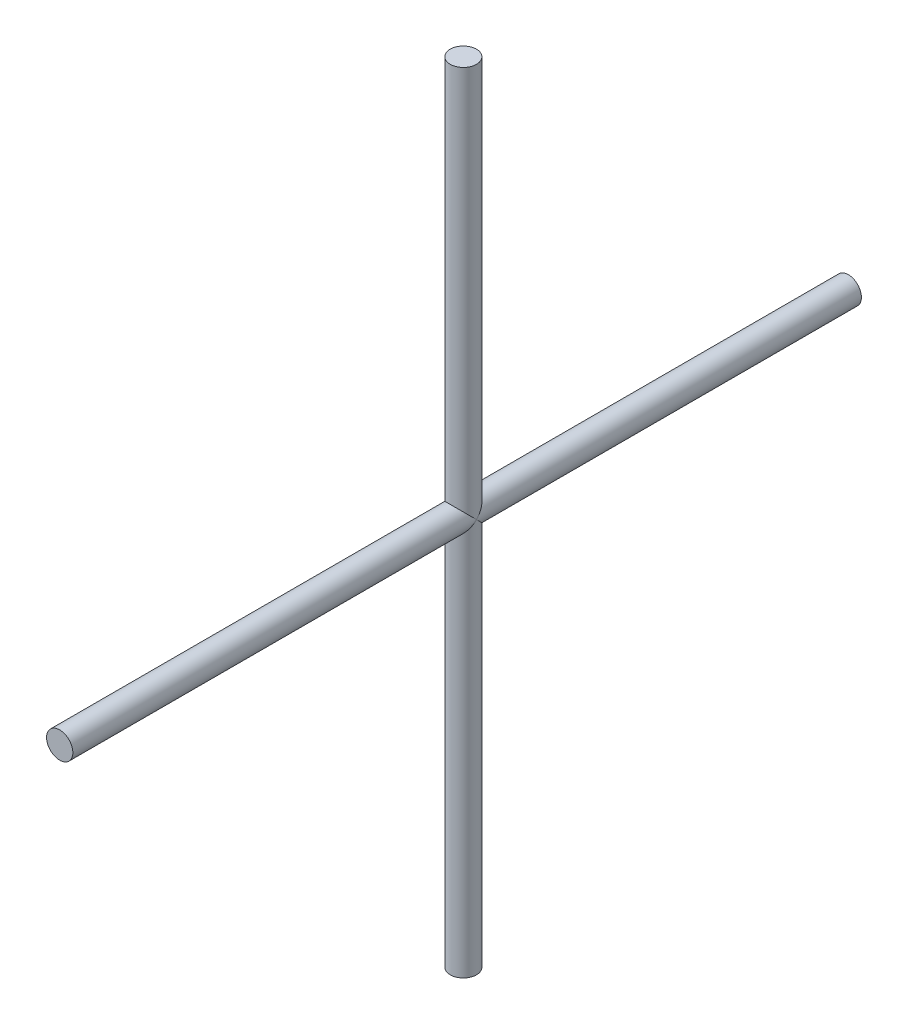
ISO-10303-21;
HEADER;
FILE_DESCRIPTION(('STEP AP214'),'2;1');
FILE_NAME('part.step','',(''),(''),'','','');
FILE_SCHEMA(('AUTOMOTIVE_DESIGN { 1 0 10303 214 1 1 1 1 }'));
ENDSEC;
DATA;
#1=APPLICATION_CONTEXT('core data for automotive mechanical design processes');
#2=APPLICATION_PROTOCOL_DEFINITION('international standard','automotive_design',2000,#1);
#3=PRODUCT_CONTEXT('',#1,'mechanical');
#4=PRODUCT('Part','Part','',(#3));
#5=PRODUCT_RELATED_PRODUCT_CATEGORY('part','',(#4));
#6=PRODUCT_DEFINITION_FORMATION('','',#4);
#7=PRODUCT_DEFINITION_CONTEXT('part definition',#1,'design');
#8=PRODUCT_DEFINITION('design','',#6,#7);
#9=PRODUCT_DEFINITION_SHAPE('','',#8);
#10=(LENGTH_UNIT() NAMED_UNIT(*) SI_UNIT(.MILLI.,.METRE.));
#11=(NAMED_UNIT(*) PLANE_ANGLE_UNIT() SI_UNIT($,.RADIAN.));
#12=(NAMED_UNIT(*) SI_UNIT($,.STERADIAN.) SOLID_ANGLE_UNIT());
#13=UNCERTAINTY_MEASURE_WITH_UNIT(LENGTH_MEASURE(1.E-05),#10,'distance_accuracy_value','');
#14=(GEOMETRIC_REPRESENTATION_CONTEXT(3) GLOBAL_UNCERTAINTY_ASSIGNED_CONTEXT((#13)) GLOBAL_UNIT_ASSIGNED_CONTEXT((#10,
#11,#12)) REPRESENTATION_CONTEXT('',''));
#15=CARTESIAN_POINT('',(0.,0.,0.));
#16=DIRECTION('',(0.,0.,1.));
#17=DIRECTION('',(1.,0.,0.));
#18=AXIS2_PLACEMENT_3D('',#15,#16,#17);
#19=CARTESIAN_POINT('',(0.,0.,300.));
#20=DIRECTION('',(0.,0.,-1.));
#21=DIRECTION('',(-1.,0.,0.));
#22=AXIS2_PLACEMENT_3D('',#19,#20,#21);
#23=CYLINDRICAL_SURFACE('',#22,5.);
#24=CARTESIAN_POINT('',(0.,0.,300.));
#25=DIRECTION('',(0.,0.,1.));
#26=DIRECTION('',(1.,0.,0.));
#27=AXIS2_PLACEMENT_3D('',#24,#25,#26);
#28=CIRCLE('',#27,5.);
#29=CARTESIAN_POINT('',(5.,0.,300.));
#30=VERTEX_POINT('',#29);
#31=EDGE_CURVE('E66',#30,#30,#28,.T.);
#32=ORIENTED_EDGE('',*,*,#31,.F.);
#33=EDGE_LOOP('',(#32));
#34=FACE_BOUND('',#33,.T.);
#35=CARTESIAN_POINT('',(0.,0.,146.435568708979));
#36=DIRECTION('',(0.,-0.707106781186547,-0.707106781186547));
#37=DIRECTION('',(0.,0.707106781186547,-0.707106781186547));
#38=AXIS2_PLACEMENT_3D('',#35,#36,#37);
#39=ELLIPSE('',#38,7.07106781186548,5.);
#40=CARTESIAN_POINT('',(5.,0.,146.435568708979));
#41=VERTEX_POINT('',#40);
#42=CARTESIAN_POINT('',(-5.,0.,146.435568708979));
#43=VERTEX_POINT('',#42);
#44=EDGE_CURVE('E48',#41,#43,#39,.T.);
#45=ORIENTED_EDGE('',*,*,#44,.F.);
#46=CARTESIAN_POINT('',(0.,0.,146.435568708979));
#47=DIRECTION('',(0.,0.707106781186547,-0.707106781186547));
#48=DIRECTION('',(0.,-0.707106781186547,-0.707106781186547));
#49=AXIS2_PLACEMENT_3D('',#46,#47,#48);
#50=ELLIPSE('',#49,7.07106781186548,5.);
#51=EDGE_CURVE('E60',#43,#41,#50,.T.);
#52=ORIENTED_EDGE('',*,*,#51,.F.);
#53=EDGE_LOOP('',(#45,#52));
#54=FACE_BOUND('',#53,.T.);
#55=ADVANCED_FACE('F39',(#34,#54),#23,.T.);
#56=CARTESIAN_POINT('',(0.,0.,300.));
#57=DIRECTION('',(0.,0.,1.));
#58=DIRECTION('',(1.,0.,0.));
#59=AXIS2_PLACEMENT_3D('',#56,#57,#58);
#60=PLANE('',#59);
#61=ORIENTED_EDGE('',*,*,#31,.T.);
#62=EDGE_LOOP('',(#61));
#63=FACE_BOUND('',#62,.T.);
#64=ADVANCED_FACE('F90',(#63),#60,.T.);
#65=CARTESIAN_POINT('',(0.,-150.,146.435568708979));
#66=DIRECTION('',(0.,1.,0.));
#67=DIRECTION('',(0.,0.,1.));
#68=AXIS2_PLACEMENT_3D('',#65,#66,#67);
#69=PLANE('',#68);
#70=CARTESIAN_POINT('',(0.,-150.,146.435568708979));
#71=DIRECTION('',(0.,1.,0.));
#72=DIRECTION('',(0.,0.,1.));
#73=AXIS2_PLACEMENT_3D('',#70,#71,#72);
#74=CIRCLE('',#73,5.);
#75=CARTESIAN_POINT('',(0.,-150.,151.435568708979));
#76=VERTEX_POINT('',#75);
#77=EDGE_CURVE('E106',#76,#76,#74,.T.);
#78=ORIENTED_EDGE('',*,*,#77,.F.);
#79=EDGE_LOOP('',(#78));
#80=FACE_BOUND('',#79,.T.);
#81=ADVANCED_FACE('F87',(#80),#69,.F.);
#82=CARTESIAN_POINT('',(0.,150.,146.435568708979));
#83=DIRECTION('',(0.,-1.,0.));
#84=DIRECTION('',(0.,0.,-1.));
#85=AXIS2_PLACEMENT_3D('',#82,#83,#84);
#86=CYLINDRICAL_SURFACE('',#85,5.);
#87=ORIENTED_EDGE('',*,*,#77,.T.);
#88=EDGE_LOOP('',(#87));
#89=FACE_BOUND('',#88,.T.);
#90=CARTESIAN_POINT('',(0.,0.,146.435568708979));
#91=DIRECTION('',(0.,0.707106781186547,-0.707106781186547));
#92=DIRECTION('',(0.,-0.707106781186547,-0.707106781186547));
#93=AXIS2_PLACEMENT_3D('',#90,#91,#92);
#94=ELLIPSE('',#93,7.07106781186548,5.);
#95=EDGE_CURVE('E54',#43,#41,#94,.F.);
#96=ORIENTED_EDGE('',*,*,#95,.T.);
#97=ORIENTED_EDGE('',*,*,#44,.T.);
#98=EDGE_LOOP('',(#96,#97));
#99=FACE_BOUND('',#98,.T.);
#100=ADVANCED_FACE('F68',(#89,#99),#86,.T.);
#101=CARTESIAN_POINT('',(0.,0.,0.));
#102=DIRECTION('',(0.,0.,1.));
#103=DIRECTION('',(1.,0.,0.));
#104=AXIS2_PLACEMENT_3D('',#101,#102,#103);
#105=PLANE('',#104);
#106=CARTESIAN_POINT('',(0.,0.,0.));
#107=DIRECTION('',(0.,0.,1.));
#108=DIRECTION('',(1.,0.,0.));
#109=AXIS2_PLACEMENT_3D('',#106,#107,#108);
#110=CIRCLE('',#109,5.);
#111=CARTESIAN_POINT('',(5.,0.,0.));
#112=VERTEX_POINT('',#111);
#113=EDGE_CURVE('E99',#112,#112,#110,.T.);
#114=ORIENTED_EDGE('',*,*,#113,.F.);
#115=EDGE_LOOP('',(#114));
#116=FACE_BOUND('',#115,.T.);
#117=ADVANCED_FACE('F81',(#116),#105,.F.);
#118=ORIENTED_EDGE('',*,*,#113,.T.);
#119=EDGE_LOOP('',(#118));
#120=FACE_BOUND('',#119,.T.);
#121=CARTESIAN_POINT('',(0.,0.,146.435568708979));
#122=DIRECTION('',(0.,-0.707106781186547,-0.707106781186547));
#123=DIRECTION('',(0.,0.707106781186547,-0.707106781186547));
#124=AXIS2_PLACEMENT_3D('',#121,#122,#123);
#125=ELLIPSE('',#124,7.07106781186548,5.);
#126=EDGE_CURVE('E11',#41,#43,#125,.F.);
#127=ORIENTED_EDGE('',*,*,#126,.F.);
#128=ORIENTED_EDGE('',*,*,#95,.F.);
#129=EDGE_LOOP('',(#127,#128));
#130=FACE_BOUND('',#129,.T.);
#131=ADVANCED_FACE('F41',(#120,#130),#23,.T.);
#132=CARTESIAN_POINT('',(0.,150.,146.435568708979));
#133=DIRECTION('',(0.,1.,0.));
#134=DIRECTION('',(0.,0.,1.));
#135=AXIS2_PLACEMENT_3D('',#132,#133,#134);
#136=CIRCLE('',#135,5.);
#137=CARTESIAN_POINT('',(0.,150.,151.435568708979));
#138=VERTEX_POINT('',#137);
#139=EDGE_CURVE('E103',#138,#138,#136,.T.);
#140=ORIENTED_EDGE('',*,*,#139,.F.);
#141=EDGE_LOOP('',(#140));
#142=FACE_BOUND('',#141,.T.);
#143=ORIENTED_EDGE('',*,*,#51,.T.);
#144=ORIENTED_EDGE('',*,*,#126,.T.);
#145=EDGE_LOOP('',(#143,#144));
#146=FACE_BOUND('',#145,.T.);
#147=ADVANCED_FACE('F70',(#142,#146),#86,.T.);
#148=CARTESIAN_POINT('',(0.,150.,146.435568708979));
#149=DIRECTION('',(0.,1.,0.));
#150=DIRECTION('',(0.,0.,1.));
#151=AXIS2_PLACEMENT_3D('',#148,#149,#150);
#152=PLANE('',#151);
#153=ORIENTED_EDGE('',*,*,#139,.T.);
#154=EDGE_LOOP('',(#153));
#155=FACE_BOUND('',#154,.T.);
#156=ADVANCED_FACE('F72',(#155),#152,.T.);
#157=CLOSED_SHELL('',(#55,#64,#81,#100,#117,#131,#147,#156));
#158=MANIFOLD_SOLID_BREP('B2',#157);
#159=ADVANCED_BREP_SHAPE_REPRESENTATION('',(#18,#158),#14);
#160=SHAPE_DEFINITION_REPRESENTATION(#9,#159);
ENDSEC;
END-ISO-10303-21;
